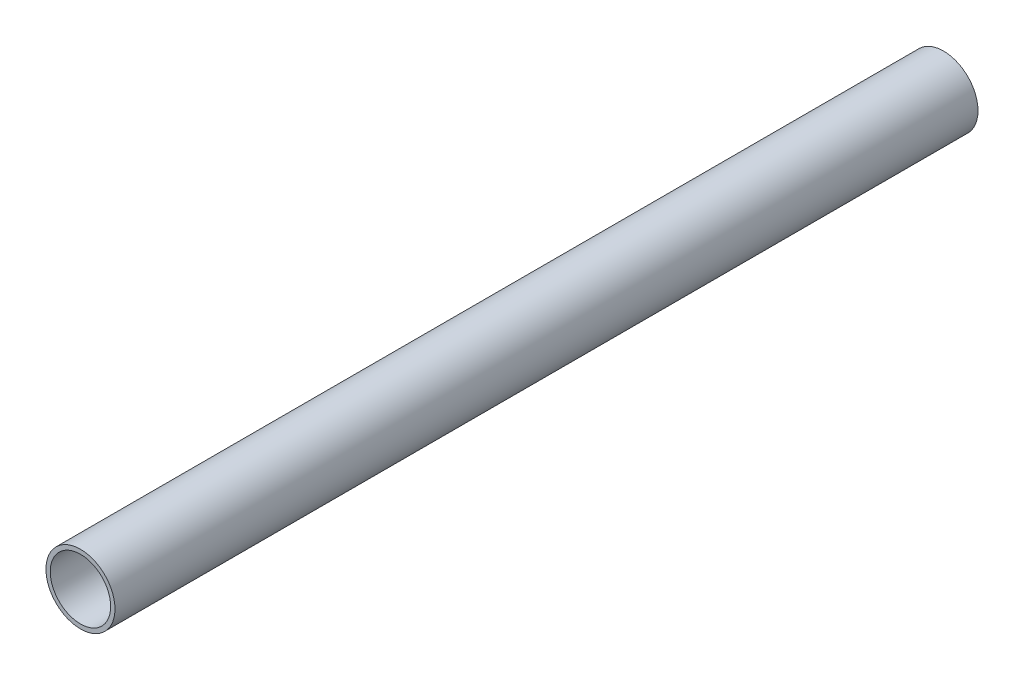
ISO-10303-21;
HEADER;
FILE_DESCRIPTION(('STEP AP214'),'2;1');
FILE_NAME('part.step','',(''),(''),'','','');
FILE_SCHEMA(('AUTOMOTIVE_DESIGN { 1 0 10303 214 1 1 1 1 }'));
ENDSEC;
DATA;
#1=APPLICATION_CONTEXT('core data for automotive mechanical design processes');
#2=APPLICATION_PROTOCOL_DEFINITION('international standard','automotive_design',2000,#1);
#3=PRODUCT_CONTEXT('',#1,'mechanical');
#4=PRODUCT('Part','Part','',(#3));
#5=PRODUCT_RELATED_PRODUCT_CATEGORY('part','',(#4));
#6=PRODUCT_DEFINITION_FORMATION('','',#4);
#7=PRODUCT_DEFINITION_CONTEXT('part definition',#1,'design');
#8=PRODUCT_DEFINITION('design','',#6,#7);
#9=PRODUCT_DEFINITION_SHAPE('','',#8);
#10=(LENGTH_UNIT() NAMED_UNIT(*) SI_UNIT(.MILLI.,.METRE.));
#11=(NAMED_UNIT(*) PLANE_ANGLE_UNIT() SI_UNIT($,.RADIAN.));
#12=(NAMED_UNIT(*) SI_UNIT($,.STERADIAN.) SOLID_ANGLE_UNIT());
#13=UNCERTAINTY_MEASURE_WITH_UNIT(LENGTH_MEASURE(1.E-05),#10,'distance_accuracy_value','');
#14=(GEOMETRIC_REPRESENTATION_CONTEXT(3) GLOBAL_UNCERTAINTY_ASSIGNED_CONTEXT((#13)) GLOBAL_UNIT_ASSIGNED_CONTEXT((#10,
#11,#12)) REPRESENTATION_CONTEXT('',''));
#15=CARTESIAN_POINT('',(0.,0.,0.));
#16=DIRECTION('',(0.,0.,1.));
#17=DIRECTION('',(1.,0.,0.));
#18=AXIS2_PLACEMENT_3D('',#15,#16,#17);
#19=CARTESIAN_POINT('',(0.,0.,200.));
#20=DIRECTION('',(0.,0.,1.));
#21=DIRECTION('',(1.,0.,0.));
#22=AXIS2_PLACEMENT_3D('',#19,#20,#21);
#23=PLANE('',#22);
#24=CARTESIAN_POINT('',(0.,0.,200.));
#25=DIRECTION('',(0.,0.,1.));
#26=DIRECTION('',(1.,0.,0.));
#27=AXIS2_PLACEMENT_3D('',#24,#25,#26);
#28=CIRCLE('',#27,8.);
#29=CARTESIAN_POINT('',(8.,0.,200.));
#30=VERTEX_POINT('',#29);
#31=EDGE_CURVE('E10',#30,#30,#28,.T.);
#32=ORIENTED_EDGE('',*,*,#31,.T.);
#33=EDGE_LOOP('',(#32));
#34=FACE_BOUND('',#33,.T.);
#35=CARTESIAN_POINT('',(0.,0.,200.));
#36=DIRECTION('',(0.,0.,1.));
#37=DIRECTION('',(1.,0.,0.));
#38=AXIS2_PLACEMENT_3D('',#35,#36,#37);
#39=CIRCLE('',#38,7.);
#40=CARTESIAN_POINT('',(7.,0.,200.));
#41=VERTEX_POINT('',#40);
#42=EDGE_CURVE('E41',#41,#41,#39,.T.);
#43=ORIENTED_EDGE('',*,*,#42,.F.);
#44=EDGE_LOOP('',(#43));
#45=FACE_BOUND('',#44,.T.);
#46=ADVANCED_FACE('F30',(#34,#45),#23,.T.);
#47=CARTESIAN_POINT('',(0.,0.,0.));
#48=DIRECTION('',(0.,0.,1.));
#49=DIRECTION('',(1.,0.,0.));
#50=AXIS2_PLACEMENT_3D('',#47,#48,#49);
#51=PLANE('',#50);
#52=CARTESIAN_POINT('',(0.,0.,0.));
#53=DIRECTION('',(0.,0.,1.));
#54=DIRECTION('',(1.,0.,0.));
#55=AXIS2_PLACEMENT_3D('',#52,#53,#54);
#56=CIRCLE('',#55,8.);
#57=CARTESIAN_POINT('',(8.,0.,0.));
#58=VERTEX_POINT('',#57);
#59=EDGE_CURVE('E34',#58,#58,#56,.T.);
#60=ORIENTED_EDGE('',*,*,#59,.F.);
#61=EDGE_LOOP('',(#60));
#62=FACE_BOUND('',#61,.T.);
#63=CARTESIAN_POINT('',(0.,0.,0.));
#64=DIRECTION('',(0.,0.,1.));
#65=DIRECTION('',(1.,0.,0.));
#66=AXIS2_PLACEMENT_3D('',#63,#64,#65);
#67=CIRCLE('',#66,7.);
#68=CARTESIAN_POINT('',(7.,0.,0.));
#69=VERTEX_POINT('',#68);
#70=EDGE_CURVE('E43',#69,#69,#67,.T.);
#71=ORIENTED_EDGE('',*,*,#70,.T.);
#72=EDGE_LOOP('',(#71));
#73=FACE_BOUND('',#72,.T.);
#74=ADVANCED_FACE('F53',(#62,#73),#51,.F.);
#75=CARTESIAN_POINT('',(0.,0.,200.));
#76=DIRECTION('',(0.,0.,-1.));
#77=DIRECTION('',(-1.,0.,0.));
#78=AXIS2_PLACEMENT_3D('',#75,#76,#77);
#79=CYLINDRICAL_SURFACE('',#78,8.);
#80=ORIENTED_EDGE('',*,*,#31,.F.);
#81=EDGE_LOOP('',(#80));
#82=FACE_BOUND('',#81,.T.);
#83=ORIENTED_EDGE('',*,*,#59,.T.);
#84=EDGE_LOOP('',(#83));
#85=FACE_BOUND('',#84,.T.);
#86=ADVANCED_FACE('F32',(#82,#85),#79,.T.);
#87=CARTESIAN_POINT('',(0.,0.,200.));
#88=DIRECTION('',(0.,0.,-1.));
#89=DIRECTION('',(-1.,0.,0.));
#90=AXIS2_PLACEMENT_3D('',#87,#88,#89);
#91=CYLINDRICAL_SURFACE('',#90,7.);
#92=ORIENTED_EDGE('',*,*,#42,.T.);
#93=EDGE_LOOP('',(#92));
#94=FACE_BOUND('',#93,.T.);
#95=ORIENTED_EDGE('',*,*,#70,.F.);
#96=EDGE_LOOP('',(#95));
#97=FACE_BOUND('',#96,.T.);
#98=ADVANCED_FACE('F49',(#94,#97),#91,.F.);
#99=CLOSED_SHELL('',(#46,#74,#86,#98));
#100=MANIFOLD_SOLID_BREP('B2',#99);
#101=ADVANCED_BREP_SHAPE_REPRESENTATION('',(#18,#100),#14);
#102=SHAPE_DEFINITION_REPRESENTATION(#9,#101);
ENDSEC;
END-ISO-10303-21;
